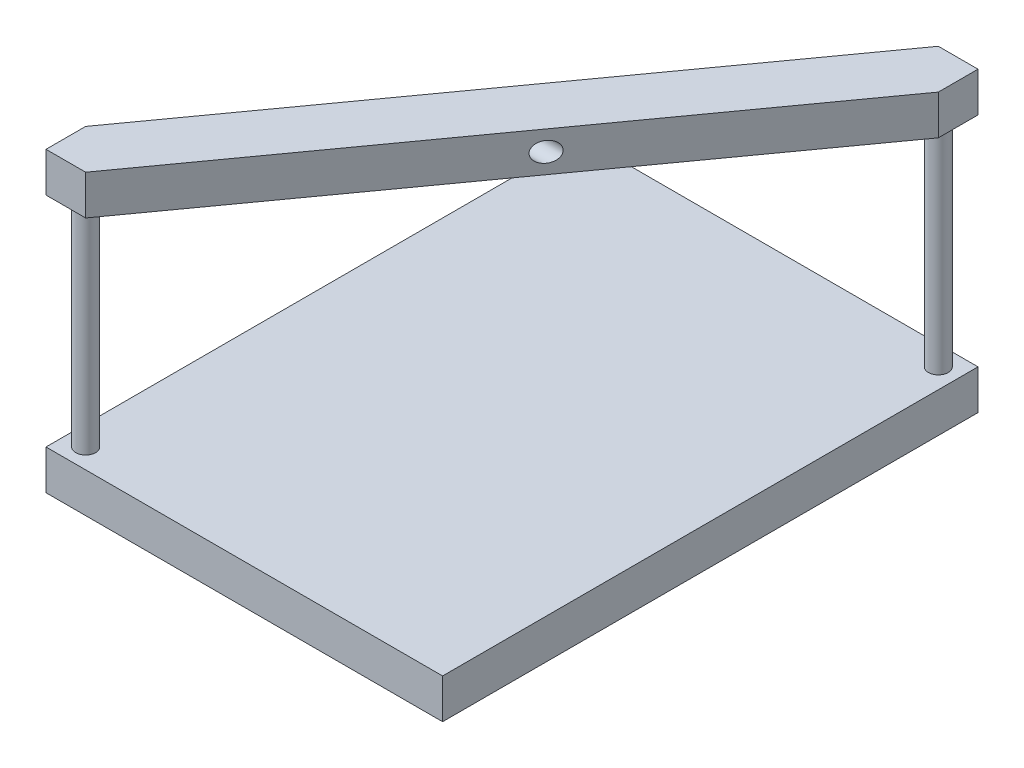
ISO-10303-21;
HEADER;
FILE_DESCRIPTION(('STEP AP214'),'2;1');
FILE_NAME('part.step','',(''),(''),'','','');
FILE_SCHEMA(('AUTOMOTIVE_DESIGN { 1 0 10303 214 1 1 1 1 }'));
ENDSEC;
DATA;
#1=APPLICATION_CONTEXT('core data for automotive mechanical design processes');
#2=APPLICATION_PROTOCOL_DEFINITION('international standard','automotive_design',2000,#1);
#3=PRODUCT_CONTEXT('',#1,'mechanical');
#4=PRODUCT('Part','Part','',(#3));
#5=PRODUCT_RELATED_PRODUCT_CATEGORY('part','',(#4));
#6=PRODUCT_DEFINITION_FORMATION('','',#4);
#7=PRODUCT_DEFINITION_CONTEXT('part definition',#1,'design');
#8=PRODUCT_DEFINITION('design','',#6,#7);
#9=PRODUCT_DEFINITION_SHAPE('','',#8);
#10=(LENGTH_UNIT() NAMED_UNIT(*) SI_UNIT(.MILLI.,.METRE.));
#11=(NAMED_UNIT(*) PLANE_ANGLE_UNIT() SI_UNIT($,.RADIAN.));
#12=(NAMED_UNIT(*) SI_UNIT($,.STERADIAN.) SOLID_ANGLE_UNIT());
#13=UNCERTAINTY_MEASURE_WITH_UNIT(LENGTH_MEASURE(1.E-05),#10,'distance_accuracy_value','');
#14=(GEOMETRIC_REPRESENTATION_CONTEXT(3) GLOBAL_UNCERTAINTY_ASSIGNED_CONTEXT((#13)) GLOBAL_UNIT_ASSIGNED_CONTEXT((#10,
#11,#12)) REPRESENTATION_CONTEXT('',''));
#15=CARTESIAN_POINT('',(0.,0.,0.));
#16=DIRECTION('',(0.,0.,1.));
#17=DIRECTION('',(1.,0.,0.));
#18=AXIS2_PLACEMENT_3D('',#15,#16,#17);
#19=CARTESIAN_POINT('',(0.,10.,0.));
#20=DIRECTION('',(1.,0.,0.));
#21=DIRECTION('',(0.,0.,-1.));
#22=AXIS2_PLACEMENT_3D('',#19,#20,#21);
#23=PLANE('',#22);
#24=DIRECTION('',(0.,0.,1.));
#25=VECTOR('',#24,1.);
#26=CARTESIAN_POINT('',(0.,0.,0.));
#27=LINE('',#26,#25);
#28=CARTESIAN_POINT('',(0.,0.,-135.));
#29=VERTEX_POINT('',#28);
#30=CARTESIAN_POINT('',(0.,0.,0.));
#31=VERTEX_POINT('',#30);
#32=EDGE_CURVE('E156',#29,#31,#27,.T.);
#33=ORIENTED_EDGE('',*,*,#32,.T.);
#34=DIRECTION('',(0.,-1.,0.));
#35=VECTOR('',#34,1.);
#36=CARTESIAN_POINT('',(0.,10.,0.));
#37=LINE('',#36,#35);
#38=CARTESIAN_POINT('',(0.,10.,0.));
#39=VERTEX_POINT('',#38);
#40=EDGE_CURVE('E175',#39,#31,#37,.T.);
#41=ORIENTED_EDGE('',*,*,#40,.F.);
#42=DIRECTION('',(0.,0.,1.));
#43=VECTOR('',#42,1.);
#44=CARTESIAN_POINT('',(0.,10.,0.));
#45=LINE('',#44,#43);
#46=CARTESIAN_POINT('',(0.,10.,-135.));
#47=VERTEX_POINT('',#46);
#48=EDGE_CURVE('E157',#47,#39,#45,.T.);
#49=ORIENTED_EDGE('',*,*,#48,.F.);
#50=DIRECTION('',(0.,-1.,0.));
#51=VECTOR('',#50,1.);
#52=CARTESIAN_POINT('',(0.,10.,-135.));
#53=LINE('',#52,#51);
#54=EDGE_CURVE('E163',#47,#29,#53,.T.);
#55=ORIENTED_EDGE('',*,*,#54,.T.);
#56=EDGE_LOOP('',(#33,#41,#49,#55));
#57=FACE_BOUND('',#56,.T.);
#58=ADVANCED_FACE('F33',(#57),#23,.F.);
#59=CARTESIAN_POINT('',(0.,10.,0.));
#60=DIRECTION('',(0.,0.,-1.));
#61=DIRECTION('',(-1.,0.,0.));
#62=AXIS2_PLACEMENT_3D('',#59,#60,#61);
#63=PLANE('',#62);
#64=DIRECTION('',(1.,0.,0.));
#65=VECTOR('',#64,1.);
#66=CARTESIAN_POINT('',(0.,0.,0.));
#67=LINE('',#66,#65);
#68=CARTESIAN_POINT('',(100.,0.,0.));
#69=VERTEX_POINT('',#68);
#70=EDGE_CURVE('E166',#31,#69,#67,.T.);
#71=ORIENTED_EDGE('',*,*,#70,.T.);
#72=DIRECTION('',(0.,-1.,0.));
#73=VECTOR('',#72,1.);
#74=CARTESIAN_POINT('',(100.,10.,0.));
#75=LINE('',#74,#73);
#76=CARTESIAN_POINT('',(100.,10.,0.));
#77=VERTEX_POINT('',#76);
#78=EDGE_CURVE('E173',#77,#69,#75,.T.);
#79=ORIENTED_EDGE('',*,*,#78,.F.);
#80=DIRECTION('',(1.,0.,0.));
#81=VECTOR('',#80,1.);
#82=CARTESIAN_POINT('',(0.,10.,0.));
#83=LINE('',#82,#81);
#84=EDGE_CURVE('E81',#39,#77,#83,.T.);
#85=ORIENTED_EDGE('',*,*,#84,.F.);
#86=ORIENTED_EDGE('',*,*,#40,.T.);
#87=EDGE_LOOP('',(#71,#79,#85,#86));
#88=FACE_BOUND('',#87,.T.);
#89=ADVANCED_FACE('F191',(#88),#63,.F.);
#90=CARTESIAN_POINT('',(100.,10.,0.));
#91=DIRECTION('',(-1.,0.,0.));
#92=DIRECTION('',(0.,0.,1.));
#93=AXIS2_PLACEMENT_3D('',#90,#91,#92);
#94=PLANE('',#93);
#95=DIRECTION('',(0.,0.,-1.));
#96=VECTOR('',#95,1.);
#97=CARTESIAN_POINT('',(100.,0.,0.));
#98=LINE('',#97,#96);
#99=CARTESIAN_POINT('',(100.,0.,-135.));
#100=VERTEX_POINT('',#99);
#101=EDGE_CURVE('E67',#69,#100,#98,.T.);
#102=ORIENTED_EDGE('',*,*,#101,.T.);
#103=DIRECTION('',(0.,-1.,0.));
#104=VECTOR('',#103,1.);
#105=CARTESIAN_POINT('',(100.,10.,-135.));
#106=LINE('',#105,#104);
#107=CARTESIAN_POINT('',(100.,10.,-135.));
#108=VERTEX_POINT('',#107);
#109=EDGE_CURVE('E171',#108,#100,#106,.T.);
#110=ORIENTED_EDGE('',*,*,#109,.F.);
#111=DIRECTION('',(0.,0.,-1.));
#112=VECTOR('',#111,1.);
#113=CARTESIAN_POINT('',(100.,10.,0.));
#114=LINE('',#113,#112);
#115=EDGE_CURVE('E160',#77,#108,#114,.T.);
#116=ORIENTED_EDGE('',*,*,#115,.F.);
#117=ORIENTED_EDGE('',*,*,#78,.T.);
#118=EDGE_LOOP('',(#102,#110,#116,#117));
#119=FACE_BOUND('',#118,.T.);
#120=ADVANCED_FACE('F194',(#119),#94,.F.);
#121=CARTESIAN_POINT('',(0.,10.,-135.));
#122=DIRECTION('',(0.,0.,1.));
#123=DIRECTION('',(1.,0.,0.));
#124=AXIS2_PLACEMENT_3D('',#121,#122,#123);
#125=PLANE('',#124);
#126=DIRECTION('',(-1.,0.,0.));
#127=VECTOR('',#126,1.);
#128=CARTESIAN_POINT('',(0.,0.,-135.));
#129=LINE('',#128,#127);
#130=EDGE_CURVE('E73',#100,#29,#129,.T.);
#131=ORIENTED_EDGE('',*,*,#130,.T.);
#132=ORIENTED_EDGE('',*,*,#54,.F.);
#133=DIRECTION('',(-1.,0.,0.));
#134=VECTOR('',#133,1.);
#135=CARTESIAN_POINT('',(0.,10.,-135.));
#136=LINE('',#135,#134);
#137=EDGE_CURVE('E49',#108,#47,#136,.T.);
#138=ORIENTED_EDGE('',*,*,#137,.F.);
#139=ORIENTED_EDGE('',*,*,#109,.T.);
#140=EDGE_LOOP('',(#131,#132,#138,#139));
#141=FACE_BOUND('',#140,.T.);
#142=ADVANCED_FACE('F184',(#141),#125,.F.);
#143=CARTESIAN_POINT('',(0.,10.,0.));
#144=DIRECTION('',(0.,-1.,0.));
#145=DIRECTION('',(0.,0.,-1.));
#146=AXIS2_PLACEMENT_3D('',#143,#144,#145);
#147=PLANE('',#146);
#148=CARTESIAN_POINT('',(5.,10.,-5.));
#149=DIRECTION('',(0.,-1.,0.));
#150=DIRECTION('',(0.,0.,-1.));
#151=AXIS2_PLACEMENT_3D('',#148,#149,#150);
#152=CIRCLE('',#151,2.5);
#153=CARTESIAN_POINT('',(5.,10.,-7.5));
#154=VERTEX_POINT('',#153);
#155=EDGE_CURVE('E11',#154,#154,#152,.F.);
#156=ORIENTED_EDGE('',*,*,#155,.F.);
#157=EDGE_LOOP('',(#156));
#158=FACE_BOUND('',#157,.T.);
#159=CARTESIAN_POINT('',(95.,10.,-130.));
#160=DIRECTION('',(0.,-1.,0.));
#161=DIRECTION('',(0.,0.,-1.));
#162=AXIS2_PLACEMENT_3D('',#159,#160,#161);
#163=CIRCLE('',#162,2.5);
#164=CARTESIAN_POINT('',(95.,10.,-132.5));
#165=VERTEX_POINT('',#164);
#166=EDGE_CURVE('E41',#165,#165,#163,.F.);
#167=ORIENTED_EDGE('',*,*,#166,.F.);
#168=EDGE_LOOP('',(#167));
#169=FACE_BOUND('',#168,.T.);
#170=ORIENTED_EDGE('',*,*,#48,.T.);
#171=ORIENTED_EDGE('',*,*,#84,.T.);
#172=ORIENTED_EDGE('',*,*,#115,.T.);
#173=ORIENTED_EDGE('',*,*,#137,.T.);
#174=EDGE_LOOP('',(#170,#171,#172,#173));
#175=FACE_BOUND('',#174,.T.);
#176=ADVANCED_FACE('F181',(#158,#169,#175),#147,.F.);
#177=CARTESIAN_POINT('',(0.,0.,0.));
#178=DIRECTION('',(0.,-1.,0.));
#179=DIRECTION('',(0.,0.,-1.));
#180=AXIS2_PLACEMENT_3D('',#177,#178,#179);
#181=PLANE('',#180);
#182=ORIENTED_EDGE('',*,*,#32,.F.);
#183=ORIENTED_EDGE('',*,*,#130,.F.);
#184=ORIENTED_EDGE('',*,*,#101,.F.);
#185=ORIENTED_EDGE('',*,*,#70,.F.);
#186=EDGE_LOOP('',(#182,#183,#184,#185));
#187=FACE_BOUND('',#186,.T.);
#188=ADVANCED_FACE('F183',(#187),#181,.T.);
#189=CARTESIAN_POINT('',(95.,65.,-130.));
#190=DIRECTION('',(0.,-1.,0.));
#191=DIRECTION('',(0.,0.,-1.));
#192=AXIS2_PLACEMENT_3D('',#189,#190,#191);
#193=CYLINDRICAL_SURFACE('',#192,2.5);
#194=CARTESIAN_POINT('',(95.,65.,-130.));
#195=DIRECTION('',(0.,1.,0.));
#196=DIRECTION('',(0.,0.,1.));
#197=AXIS2_PLACEMENT_3D('',#194,#195,#196);
#198=CIRCLE('',#197,2.5);
#199=CARTESIAN_POINT('',(95.,65.,-127.5));
#200=VERTEX_POINT('',#199);
#201=EDGE_CURVE('E148',#200,#200,#198,.T.);
#202=ORIENTED_EDGE('',*,*,#201,.F.);
#203=EDGE_LOOP('',(#202));
#204=FACE_BOUND('',#203,.T.);
#205=ORIENTED_EDGE('',*,*,#166,.T.);
#206=EDGE_LOOP('',(#205));
#207=FACE_BOUND('',#206,.T.);
#208=ADVANCED_FACE('F179',(#204,#207),#193,.T.);
#209=CARTESIAN_POINT('',(5.,65.,-5.));
#210=DIRECTION('',(0.,-1.,0.));
#211=DIRECTION('',(0.,0.,-1.));
#212=AXIS2_PLACEMENT_3D('',#209,#210,#211);
#213=CYLINDRICAL_SURFACE('',#212,2.5);
#214=CARTESIAN_POINT('',(5.,65.,-5.));
#215=DIRECTION('',(0.,1.,0.));
#216=DIRECTION('',(0.,0.,1.));
#217=AXIS2_PLACEMENT_3D('',#214,#215,#216);
#218=CIRCLE('',#217,2.5);
#219=CARTESIAN_POINT('',(5.,65.,-2.5));
#220=VERTEX_POINT('',#219);
#221=EDGE_CURVE('E145',#220,#220,#218,.T.);
#222=ORIENTED_EDGE('',*,*,#221,.F.);
#223=EDGE_LOOP('',(#222));
#224=FACE_BOUND('',#223,.T.);
#225=ORIENTED_EDGE('',*,*,#155,.T.);
#226=EDGE_LOOP('',(#225));
#227=FACE_BOUND('',#226,.T.);
#228=ADVANCED_FACE('F200',(#224,#227),#213,.T.);
#229=CARTESIAN_POINT('',(0.,75.,0.));
#230=DIRECTION('',(1.,0.,0.));
#231=DIRECTION('',(0.,0.,-1.));
#232=AXIS2_PLACEMENT_3D('',#229,#230,#231);
#233=PLANE('',#232);
#234=DIRECTION('',(0.,0.,1.));
#235=VECTOR('',#234,1.);
#236=CARTESIAN_POINT('',(0.,65.,0.));
#237=LINE('',#236,#235);
#238=CARTESIAN_POINT('',(0.,65.,-10.));
#239=VERTEX_POINT('',#238);
#240=CARTESIAN_POINT('',(0.,65.,0.));
#241=VERTEX_POINT('',#240);
#242=EDGE_CURVE('E144',#239,#241,#237,.T.);
#243=ORIENTED_EDGE('',*,*,#242,.T.);
#244=DIRECTION('',(0.,-1.,0.));
#245=VECTOR('',#244,1.);
#246=CARTESIAN_POINT('',(0.,75.,0.));
#247=LINE('',#246,#245);
#248=CARTESIAN_POINT('',(0.,75.,0.));
#249=VERTEX_POINT('',#248);
#250=EDGE_CURVE('E124',#249,#241,#247,.T.);
#251=ORIENTED_EDGE('',*,*,#250,.F.);
#252=DIRECTION('',(0.,0.,1.));
#253=VECTOR('',#252,1.);
#254=CARTESIAN_POINT('',(0.,75.,0.));
#255=LINE('',#254,#253);
#256=CARTESIAN_POINT('',(0.,75.,-10.));
#257=VERTEX_POINT('',#256);
#258=EDGE_CURVE('E131',#257,#249,#255,.T.);
#259=ORIENTED_EDGE('',*,*,#258,.F.);
#260=DIRECTION('',(0.,-1.,0.));
#261=VECTOR('',#260,1.);
#262=CARTESIAN_POINT('',(0.,75.,-10.));
#263=LINE('',#262,#261);
#264=EDGE_CURVE('E343',#257,#239,#263,.T.);
#265=ORIENTED_EDGE('',*,*,#264,.T.);
#266=EDGE_LOOP('',(#243,#251,#259,#265));
#267=FACE_BOUND('',#266,.T.);
#268=ADVANCED_FACE('F142',(#267),#233,.F.);
#269=CARTESIAN_POINT('',(0.,75.,0.));
#270=DIRECTION('',(0.,0.,-1.));
#271=DIRECTION('',(-1.,0.,0.));
#272=AXIS2_PLACEMENT_3D('',#269,#270,#271);
#273=PLANE('',#272);
#274=DIRECTION('',(1.,0.,0.));
#275=VECTOR('',#274,1.);
#276=CARTESIAN_POINT('',(0.,65.,0.));
#277=LINE('',#276,#275);
#278=CARTESIAN_POINT('',(10.,65.,0.));
#279=VERTEX_POINT('',#278);
#280=EDGE_CURVE('E334',#241,#279,#277,.T.);
#281=ORIENTED_EDGE('',*,*,#280,.T.);
#282=DIRECTION('',(0.,-1.,0.));
#283=VECTOR('',#282,1.);
#284=CARTESIAN_POINT('',(10.,75.,0.));
#285=LINE('',#284,#283);
#286=CARTESIAN_POINT('',(10.,75.,0.));
#287=VERTEX_POINT('',#286);
#288=EDGE_CURVE('E127',#287,#279,#285,.T.);
#289=ORIENTED_EDGE('',*,*,#288,.F.);
#290=DIRECTION('',(1.,0.,0.));
#291=VECTOR('',#290,1.);
#292=CARTESIAN_POINT('',(0.,75.,0.));
#293=LINE('',#292,#291);
#294=EDGE_CURVE('E120',#249,#287,#293,.T.);
#295=ORIENTED_EDGE('',*,*,#294,.F.);
#296=ORIENTED_EDGE('',*,*,#250,.T.);
#297=EDGE_LOOP('',(#281,#289,#295,#296));
#298=FACE_BOUND('',#297,.T.);
#299=ADVANCED_FACE('F122',(#298),#273,.F.);
#300=CARTESIAN_POINT('',(10.,75.,0.));
#301=DIRECTION('',(-0.811534341451494,0.,-0.584304725845076));
#302=DIRECTION('',(-0.584304725845076,0.,0.811534341451494));
#303=AXIS2_PLACEMENT_3D('',#300,#301,#302);
#304=PLANE('',#303);
#305=CARTESIAN_POINT('',(58.6,70.,-67.5));
#306=DIRECTION('',(-0.811534341451494,0.,-0.584304725845076));
#307=DIRECTION('',(0.584304725845076,0.,-0.811534341451494));
#308=AXIS2_PLACEMENT_3D('',#305,#306,#307);
#309=ELLIPSE('',#308,3.08058436014987,2.5);
#310=CARTESIAN_POINT('',(60.4,70.,-70.));
#311=VERTEX_POINT('',#310);
#312=EDGE_CURVE('E332',#311,#311,#309,.F.);
#313=ORIENTED_EDGE('',*,*,#312,.F.);
#314=EDGE_LOOP('',(#313));
#315=FACE_BOUND('',#314,.T.);
#316=DIRECTION('',(0.584304725845076,0.,-0.811534341451494));
#317=VECTOR('',#316,1.);
#318=CARTESIAN_POINT('',(10.,65.,0.));
#319=LINE('',#318,#317);
#320=CARTESIAN_POINT('',(100.,65.,-125.));
#321=VERTEX_POINT('',#320);
#322=EDGE_CURVE('E346',#279,#321,#319,.T.);
#323=ORIENTED_EDGE('',*,*,#322,.T.);
#324=DIRECTION('',(0.,-1.,0.));
#325=VECTOR('',#324,1.);
#326=CARTESIAN_POINT('',(100.,75.,-125.));
#327=LINE('',#326,#325);
#328=CARTESIAN_POINT('',(100.,75.,-125.));
#329=VERTEX_POINT('',#328);
#330=EDGE_CURVE('E150',#329,#321,#327,.T.);
#331=ORIENTED_EDGE('',*,*,#330,.F.);
#332=DIRECTION('',(0.584304725845076,0.,-0.811534341451494));
#333=VECTOR('',#332,1.);
#334=CARTESIAN_POINT('',(10.,75.,0.));
#335=LINE('',#334,#333);
#336=EDGE_CURVE('E130',#287,#329,#335,.T.);
#337=ORIENTED_EDGE('',*,*,#336,.F.);
#338=ORIENTED_EDGE('',*,*,#288,.T.);
#339=EDGE_LOOP('',(#323,#331,#337,#338));
#340=FACE_BOUND('',#339,.T.);
#341=ADVANCED_FACE('F255',(#315,#340),#304,.F.);
#342=CARTESIAN_POINT('',(100.,75.,-125.));
#343=DIRECTION('',(-1.,0.,0.));
#344=DIRECTION('',(0.,0.,1.));
#345=AXIS2_PLACEMENT_3D('',#342,#343,#344);
#346=PLANE('',#345);
#347=DIRECTION('',(0.,0.,-1.));
#348=VECTOR('',#347,1.);
#349=CARTESIAN_POINT('',(100.,65.,-125.));
#350=LINE('',#349,#348);
#351=CARTESIAN_POINT('',(100.,65.,-135.));
#352=VERTEX_POINT('',#351);
#353=EDGE_CURVE('E348',#321,#352,#350,.T.);
#354=ORIENTED_EDGE('',*,*,#353,.T.);
#355=DIRECTION('',(0.,-1.,0.));
#356=VECTOR('',#355,1.);
#357=CARTESIAN_POINT('',(100.,75.,-135.));
#358=LINE('',#357,#356);
#359=CARTESIAN_POINT('',(100.,75.,-135.));
#360=VERTEX_POINT('',#359);
#361=EDGE_CURVE('E357',#360,#352,#358,.T.);
#362=ORIENTED_EDGE('',*,*,#361,.F.);
#363=DIRECTION('',(0.,0.,-1.));
#364=VECTOR('',#363,1.);
#365=CARTESIAN_POINT('',(100.,75.,-125.));
#366=LINE('',#365,#364);
#367=EDGE_CURVE('E339',#329,#360,#366,.T.);
#368=ORIENTED_EDGE('',*,*,#367,.F.);
#369=ORIENTED_EDGE('',*,*,#330,.T.);
#370=EDGE_LOOP('',(#354,#362,#368,#369));
#371=FACE_BOUND('',#370,.T.);
#372=ADVANCED_FACE('F262',(#371),#346,.F.);
#373=CARTESIAN_POINT('',(90.,75.,-135.));
#374=DIRECTION('',(0.,0.,1.));
#375=DIRECTION('',(1.,0.,0.));
#376=AXIS2_PLACEMENT_3D('',#373,#374,#375);
#377=PLANE('',#376);
#378=DIRECTION('',(-1.,0.,0.));
#379=VECTOR('',#378,1.);
#380=CARTESIAN_POINT('',(90.,65.,-135.));
#381=LINE('',#380,#379);
#382=CARTESIAN_POINT('',(90.,65.,-135.));
#383=VERTEX_POINT('',#382);
#384=EDGE_CURVE('E350',#352,#383,#381,.T.);
#385=ORIENTED_EDGE('',*,*,#384,.T.);
#386=DIRECTION('',(0.,-1.,0.));
#387=VECTOR('',#386,1.);
#388=CARTESIAN_POINT('',(90.,75.,-135.));
#389=LINE('',#388,#387);
#390=CARTESIAN_POINT('',(90.,75.,-135.));
#391=VERTEX_POINT('',#390);
#392=EDGE_CURVE('E354',#391,#383,#389,.T.);
#393=ORIENTED_EDGE('',*,*,#392,.F.);
#394=DIRECTION('',(-1.,0.,0.));
#395=VECTOR('',#394,1.);
#396=CARTESIAN_POINT('',(90.,75.,-135.));
#397=LINE('',#396,#395);
#398=EDGE_CURVE('E341',#360,#391,#397,.T.);
#399=ORIENTED_EDGE('',*,*,#398,.F.);
#400=ORIENTED_EDGE('',*,*,#361,.T.);
#401=EDGE_LOOP('',(#385,#393,#399,#400));
#402=FACE_BOUND('',#401,.T.);
#403=ADVANCED_FACE('F267',(#402),#377,.F.);
#404=CARTESIAN_POINT('',(90.,75.,-135.));
#405=DIRECTION('',(0.811534341451494,0.,0.584304725845076));
#406=DIRECTION('',(0.584304725845076,0.,-0.811534341451494));
#407=AXIS2_PLACEMENT_3D('',#404,#405,#406);
#408=PLANE('',#407);
#409=CARTESIAN_POINT('',(41.4,70.,-67.5));
#410=DIRECTION('',(0.811534341451494,0.,0.584304725845076));
#411=DIRECTION('',(0.584304725845076,0.,-0.811534341451494));
#412=AXIS2_PLACEMENT_3D('',#409,#410,#411);
#413=ELLIPSE('',#412,3.08058436014987,2.5);
#414=CARTESIAN_POINT('',(43.2,70.,-70.));
#415=VERTEX_POINT('',#414);
#416=EDGE_CURVE('E329',#415,#415,#413,.F.);
#417=ORIENTED_EDGE('',*,*,#416,.F.);
#418=EDGE_LOOP('',(#417));
#419=FACE_BOUND('',#418,.T.);
#420=DIRECTION('',(-0.584304725845076,0.,0.811534341451494));
#421=VECTOR('',#420,1.);
#422=CARTESIAN_POINT('',(90.,65.,-135.));
#423=LINE('',#422,#421);
#424=EDGE_CURVE('E140',#383,#239,#423,.T.);
#425=ORIENTED_EDGE('',*,*,#424,.T.);
#426=ORIENTED_EDGE('',*,*,#264,.F.);
#427=DIRECTION('',(-0.584304725845076,0.,0.811534341451494));
#428=VECTOR('',#427,1.);
#429=CARTESIAN_POINT('',(90.,75.,-135.));
#430=LINE('',#429,#428);
#431=EDGE_CURVE('E136',#391,#257,#430,.T.);
#432=ORIENTED_EDGE('',*,*,#431,.F.);
#433=ORIENTED_EDGE('',*,*,#392,.T.);
#434=EDGE_LOOP('',(#425,#426,#432,#433));
#435=FACE_BOUND('',#434,.T.);
#436=ADVANCED_FACE('F277',(#419,#435),#408,.F.);
#437=CARTESIAN_POINT('',(0.,75.,0.));
#438=DIRECTION('',(0.,-1.,0.));
#439=DIRECTION('',(0.,0.,-1.));
#440=AXIS2_PLACEMENT_3D('',#437,#438,#439);
#441=PLANE('',#440);
#442=ORIENTED_EDGE('',*,*,#258,.T.);
#443=ORIENTED_EDGE('',*,*,#294,.T.);
#444=ORIENTED_EDGE('',*,*,#336,.T.);
#445=ORIENTED_EDGE('',*,*,#367,.T.);
#446=ORIENTED_EDGE('',*,*,#398,.T.);
#447=ORIENTED_EDGE('',*,*,#431,.T.);
#448=EDGE_LOOP('',(#442,#443,#444,#445,#446,#447));
#449=FACE_BOUND('',#448,.T.);
#450=ADVANCED_FACE('F134',(#449),#441,.F.);
#451=CARTESIAN_POINT('',(0.,65.,0.));
#452=DIRECTION('',(0.,-1.,0.));
#453=DIRECTION('',(0.,0.,-1.));
#454=AXIS2_PLACEMENT_3D('',#451,#452,#453);
#455=PLANE('',#454);
#456=ORIENTED_EDGE('',*,*,#201,.T.);
#457=EDGE_LOOP('',(#456));
#458=FACE_BOUND('',#457,.T.);
#459=ORIENTED_EDGE('',*,*,#221,.T.);
#460=EDGE_LOOP('',(#459));
#461=FACE_BOUND('',#460,.T.);
#462=ORIENTED_EDGE('',*,*,#242,.F.);
#463=ORIENTED_EDGE('',*,*,#424,.F.);
#464=ORIENTED_EDGE('',*,*,#384,.F.);
#465=ORIENTED_EDGE('',*,*,#353,.F.);
#466=ORIENTED_EDGE('',*,*,#322,.F.);
#467=ORIENTED_EDGE('',*,*,#280,.F.);
#468=EDGE_LOOP('',(#462,#463,#464,#465,#466,#467));
#469=FACE_BOUND('',#468,.T.);
#470=ADVANCED_FACE('F289',(#458,#461,#469),#455,.T.);
#471=CARTESIAN_POINT('',(-0.001000000000001,70.,-67.5));
#472=DIRECTION('',(1.,0.,0.));
#473=DIRECTION('',(0.,0.,-1.));
#474=AXIS2_PLACEMENT_3D('',#471,#472,#473);
#475=CYLINDRICAL_SURFACE('',#474,2.5);
#476=ORIENTED_EDGE('',*,*,#416,.T.);
#477=EDGE_LOOP('',(#476));
#478=FACE_BOUND('',#477,.T.);
#479=ORIENTED_EDGE('',*,*,#312,.T.);
#480=EDGE_LOOP('',(#479));
#481=FACE_BOUND('',#480,.T.);
#482=ADVANCED_FACE('F298',(#478,#481),#475,.F.);
#483=CLOSED_SHELL('',(#58,#89,#120,#142,#176,#188,#208,#228,#268,#299,#341,#372,#403,#436,#450,
#470,#482));
#484=MANIFOLD_SOLID_BREP('B2',#483);
#485=ADVANCED_BREP_SHAPE_REPRESENTATION('',(#18,#484),#14);
#486=SHAPE_DEFINITION_REPRESENTATION(#9,#485);
ENDSEC;
END-ISO-10303-21;
